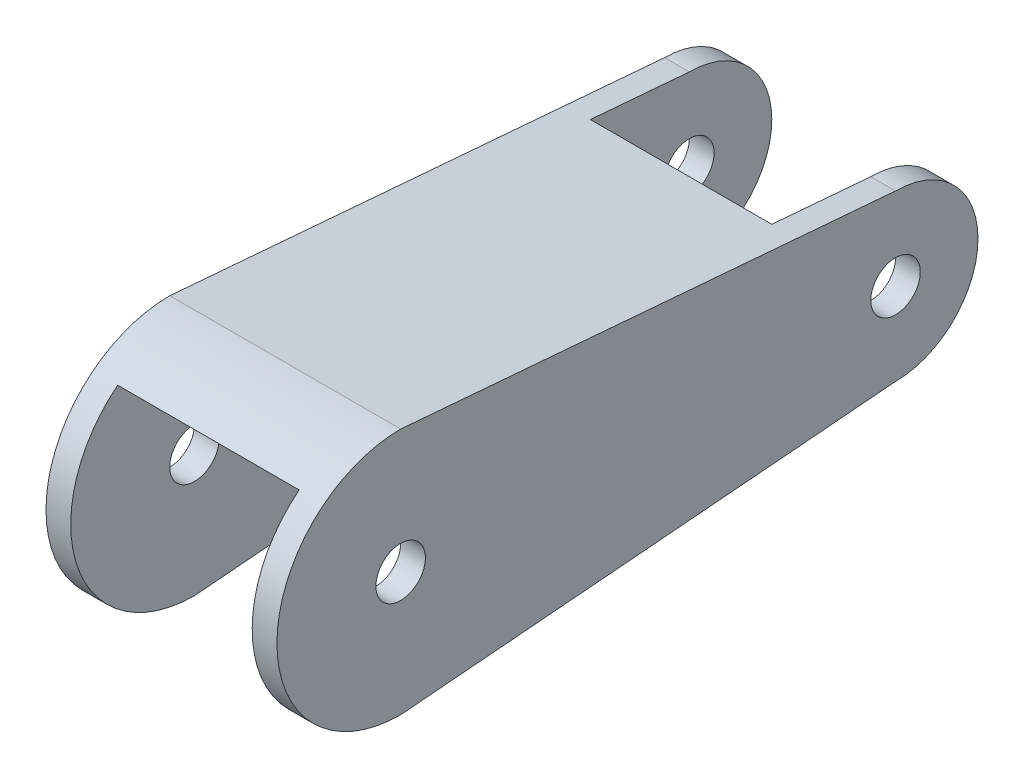
ISO-10303-21;
HEADER;
FILE_DESCRIPTION(('STEP AP214'),'2;1');
FILE_NAME('part.step','',(''),(''),'','','');
FILE_SCHEMA(('AUTOMOTIVE_DESIGN { 1 0 10303 214 1 1 1 1 }'));
ENDSEC;
DATA;
#1=APPLICATION_CONTEXT('core data for automotive mechanical design processes');
#2=APPLICATION_PROTOCOL_DEFINITION('international standard','automotive_design',2000,#1);
#3=PRODUCT_CONTEXT('',#1,'mechanical');
#4=PRODUCT('Part','Part','',(#3));
#5=PRODUCT_RELATED_PRODUCT_CATEGORY('part','',(#4));
#6=PRODUCT_DEFINITION_FORMATION('','',#4);
#7=PRODUCT_DEFINITION_CONTEXT('part definition',#1,'design');
#8=PRODUCT_DEFINITION('design','',#6,#7);
#9=PRODUCT_DEFINITION_SHAPE('','',#8);
#10=(LENGTH_UNIT() NAMED_UNIT(*) SI_UNIT(.MILLI.,.METRE.));
#11=(NAMED_UNIT(*) PLANE_ANGLE_UNIT() SI_UNIT($,.RADIAN.));
#12=(NAMED_UNIT(*) SI_UNIT($,.STERADIAN.) SOLID_ANGLE_UNIT());
#13=UNCERTAINTY_MEASURE_WITH_UNIT(LENGTH_MEASURE(1.E-05),#10,'distance_accuracy_value','');
#14=(GEOMETRIC_REPRESENTATION_CONTEXT(3) GLOBAL_UNCERTAINTY_ASSIGNED_CONTEXT((#13)) GLOBAL_UNIT_ASSIGNED_CONTEXT((#10,
#11,#12)) REPRESENTATION_CONTEXT('',''));
#15=CARTESIAN_POINT('',(0.,0.,0.));
#16=DIRECTION('',(0.,0.,1.));
#17=DIRECTION('',(1.,0.,0.));
#18=AXIS2_PLACEMENT_3D('',#15,#16,#17);
#19=CARTESIAN_POINT('',(70.,-37.5,0.));
#20=DIRECTION('',(0.,0.99654575824488,0.08304547985374));
#21=DIRECTION('',(0.,-0.08304547985374,0.99654575824488));
#22=AXIS2_PLACEMENT_3D('',#19,#20,#21);
#23=PLANE('',#22);
#24=DIRECTION('',(-1.,0.,0.));
#25=VECTOR('',#24,1.);
#26=CARTESIAN_POINT('',(70.,-37.5,0.));
#27=LINE('',#26,#25);
#28=CARTESIAN_POINT('',(70.,-37.5,0.));
#29=VERTEX_POINT('',#28);
#30=CARTESIAN_POINT('',(62.5,-37.5,0.));
#31=VERTEX_POINT('',#30);
#32=EDGE_CURVE('E182',#29,#31,#27,.T.);
#33=ORIENTED_EDGE('',*,*,#32,.T.);
#34=DIRECTION('',(0.,-0.08304547985374,0.99654575824488));
#35=VECTOR('',#34,1.);
#36=CARTESIAN_POINT('',(62.5,-37.5,0.));
#37=LINE('',#36,#35);
#38=CARTESIAN_POINT('',(62.5,-25.,-150.));
#39=VERTEX_POINT('',#38);
#40=EDGE_CURVE('E120',#39,#31,#37,.T.);
#41=ORIENTED_EDGE('',*,*,#40,.F.);
#42=DIRECTION('',(-1.,0.,0.));
#43=VECTOR('',#42,1.);
#44=CARTESIAN_POINT('',(70.,-25.,-150.));
#45=LINE('',#44,#43);
#46=CARTESIAN_POINT('',(70.,-25.,-150.));
#47=VERTEX_POINT('',#46);
#48=EDGE_CURVE('E178',#47,#39,#45,.T.);
#49=ORIENTED_EDGE('',*,*,#48,.F.);
#50=DIRECTION('',(0.,0.0830454798537399,-0.99654575824488));
#51=VECTOR('',#50,1.);
#52=CARTESIAN_POINT('',(70.,-37.5,0.));
#53=LINE('',#52,#51);
#54=EDGE_CURVE('E154',#29,#47,#53,.T.);
#55=ORIENTED_EDGE('',*,*,#54,.F.);
#56=EDGE_LOOP('',(#33,#41,#49,#55));
#57=FACE_BOUND('',#56,.T.);
#58=ADVANCED_FACE('F36',(#57),#23,.F.);
#59=CARTESIAN_POINT('',(7.49999999999999,37.5,-120.));
#60=DIRECTION('',(0.,0.,-1.));
#61=DIRECTION('',(-1.,0.,0.));
#62=AXIS2_PLACEMENT_3D('',#59,#60,#61);
#63=PLANE('',#62);
#64=DIRECTION('',(0.,-1.,0.));
#65=VECTOR('',#64,1.);
#66=CARTESIAN_POINT('',(62.5,37.5,-120.));
#67=LINE('',#66,#65);
#68=CARTESIAN_POINT('',(62.5,27.5,-120.));
#69=VERTEX_POINT('',#68);
#70=CARTESIAN_POINT('',(62.5,17.4653378510064,-120.));
#71=VERTEX_POINT('',#70);
#72=EDGE_CURVE('E61',#69,#71,#67,.T.);
#73=ORIENTED_EDGE('',*,*,#72,.T.);
#74=DIRECTION('',(-1.,0.,0.));
#75=VECTOR('',#74,1.);
#76=CARTESIAN_POINT('',(7.49999999999999,17.4653378510064,-120.));
#77=LINE('',#76,#75);
#78=CARTESIAN_POINT('',(7.49999999999999,17.4653378510064,-120.));
#79=VERTEX_POINT('',#78);
#80=EDGE_CURVE('E129',#71,#79,#77,.T.);
#81=ORIENTED_EDGE('',*,*,#80,.T.);
#82=DIRECTION('',(0.,-1.,0.));
#83=VECTOR('',#82,1.);
#84=CARTESIAN_POINT('',(7.49999999999999,37.5,-120.));
#85=LINE('',#84,#83);
#86=CARTESIAN_POINT('',(7.49999999999999,27.5,-120.));
#87=VERTEX_POINT('',#86);
#88=EDGE_CURVE('E140',#87,#79,#85,.T.);
#89=ORIENTED_EDGE('',*,*,#88,.F.);
#90=DIRECTION('',(1.,0.,0.));
#91=VECTOR('',#90,1.);
#92=CARTESIAN_POINT('',(70.,27.5,-120.));
#93=LINE('',#92,#91);
#94=EDGE_CURVE('E45',#87,#69,#93,.T.);
#95=ORIENTED_EDGE('',*,*,#94,.T.);
#96=EDGE_LOOP('',(#73,#81,#89,#95));
#97=FACE_BOUND('',#96,.T.);
#98=ADVANCED_FACE('F209',(#97),#63,.T.);
#99=DIRECTION('',(0.,0.08304547985374,-0.99654575824488));
#100=VECTOR('',#99,1.);
#101=CARTESIAN_POINT('',(7.49999999999999,-37.5,0.));
#102=LINE('',#101,#100);
#103=CARTESIAN_POINT('',(7.50000000000001,-37.5,0.));
#104=VERTEX_POINT('',#103);
#105=CARTESIAN_POINT('',(7.49999999999998,-25.,-150.));
#106=VERTEX_POINT('',#105);
#107=EDGE_CURVE('E148',#104,#106,#102,.T.);
#108=ORIENTED_EDGE('',*,*,#107,.F.);
#109=CARTESIAN_POINT('',(0.,-37.5,0.));
#110=VERTEX_POINT('',#109);
#111=EDGE_CURVE('E181',#104,#110,#27,.T.);
#112=ORIENTED_EDGE('',*,*,#111,.T.);
#113=DIRECTION('',(0.,0.0830454798537399,-0.99654575824488));
#114=VECTOR('',#113,1.);
#115=CARTESIAN_POINT('',(0.,-37.5,0.));
#116=LINE('',#115,#114);
#117=CARTESIAN_POINT('',(0.,-25.,-150.));
#118=VERTEX_POINT('',#117);
#119=EDGE_CURVE('E164',#110,#118,#116,.T.);
#120=ORIENTED_EDGE('',*,*,#119,.T.);
#121=EDGE_CURVE('E177',#106,#118,#45,.T.);
#122=ORIENTED_EDGE('',*,*,#121,.F.);
#123=EDGE_LOOP('',(#108,#112,#120,#122));
#124=FACE_BOUND('',#123,.T.);
#125=ADVANCED_FACE('F233',(#124),#23,.F.);
#126=CARTESIAN_POINT('',(70.,0.,-150.));
#127=DIRECTION('',(-1.,0.,0.));
#128=DIRECTION('',(0.,0.,1.));
#129=AXIS2_PLACEMENT_3D('',#126,#127,#128);
#130=CYLINDRICAL_SURFACE('',#129,25.);
#131=DIRECTION('',(-1.,0.,0.));
#132=VECTOR('',#131,1.);
#133=CARTESIAN_POINT('',(70.,25.,-150.));
#134=LINE('',#133,#132);
#135=CARTESIAN_POINT('',(7.49999999999998,25.,-150.));
#136=VERTEX_POINT('',#135);
#137=CARTESIAN_POINT('',(0.,25.,-150.));
#138=VERTEX_POINT('',#137);
#139=EDGE_CURVE('E173',#136,#138,#134,.T.);
#140=ORIENTED_EDGE('',*,*,#139,.F.);
#141=CARTESIAN_POINT('',(7.49999999999998,0.,-150.));
#142=DIRECTION('',(1.,0.,0.));
#143=DIRECTION('',(0.,0.,-1.));
#144=AXIS2_PLACEMENT_3D('',#141,#142,#143);
#145=CIRCLE('',#144,25.);
#146=EDGE_CURVE('E146',#106,#136,#145,.T.);
#147=ORIENTED_EDGE('',*,*,#146,.F.);
#148=ORIENTED_EDGE('',*,*,#121,.T.);
#149=CARTESIAN_POINT('',(0.,0.,-150.));
#150=DIRECTION('',(1.,0.,0.));
#151=DIRECTION('',(0.,0.,-1.));
#152=AXIS2_PLACEMENT_3D('',#149,#150,#151);
#153=CIRCLE('',#152,25.);
#154=EDGE_CURVE('E167',#118,#138,#153,.T.);
#155=ORIENTED_EDGE('',*,*,#154,.T.);
#156=EDGE_LOOP('',(#140,#147,#148,#155));
#157=FACE_BOUND('',#156,.T.);
#158=ADVANCED_FACE('F236',(#157),#130,.T.);
#159=CARTESIAN_POINT('',(62.5,0.,-150.));
#160=DIRECTION('',(-1.,0.,0.));
#161=DIRECTION('',(0.,0.,1.));
#162=AXIS2_PLACEMENT_3D('',#159,#160,#161);
#163=CIRCLE('',#162,25.);
#164=CARTESIAN_POINT('',(62.5,25.,-150.));
#165=VERTEX_POINT('',#164);
#166=EDGE_CURVE('E143',#165,#39,#163,.T.);
#167=ORIENTED_EDGE('',*,*,#166,.F.);
#168=CARTESIAN_POINT('',(70.,25.,-150.));
#169=VERTEX_POINT('',#168);
#170=EDGE_CURVE('E174',#169,#165,#134,.T.);
#171=ORIENTED_EDGE('',*,*,#170,.F.);
#172=CARTESIAN_POINT('',(70.,0.,-150.));
#173=DIRECTION('',(1.,0.,0.));
#174=DIRECTION('',(0.,0.,-1.));
#175=AXIS2_PLACEMENT_3D('',#172,#173,#174);
#176=CIRCLE('',#175,25.);
#177=EDGE_CURVE('E157',#47,#169,#176,.T.);
#178=ORIENTED_EDGE('',*,*,#177,.F.);
#179=ORIENTED_EDGE('',*,*,#48,.T.);
#180=EDGE_LOOP('',(#167,#171,#178,#179));
#181=FACE_BOUND('',#180,.T.);
#182=ADVANCED_FACE('F220',(#181),#130,.T.);
#183=CARTESIAN_POINT('',(70.,37.5,0.));
#184=DIRECTION('',(0.,-0.99654575824488,0.08304547985374));
#185=DIRECTION('',(0.,-0.08304547985374,-0.99654575824488));
#186=AXIS2_PLACEMENT_3D('',#183,#184,#185);
#187=PLANE('',#186);
#188=DIRECTION('',(0.,0.08304547985374,0.99654575824488));
#189=VECTOR('',#188,1.);
#190=CARTESIAN_POINT('',(7.49999999999999,37.5,0.));
#191=LINE('',#190,#189);
#192=EDGE_CURVE('E11',#136,#87,#191,.T.);
#193=ORIENTED_EDGE('',*,*,#192,.F.);
#194=ORIENTED_EDGE('',*,*,#139,.T.);
#195=DIRECTION('',(0.,0.08304547985374,0.99654575824488));
#196=VECTOR('',#195,1.);
#197=CARTESIAN_POINT('',(0.,37.5,0.));
#198=LINE('',#197,#196);
#199=CARTESIAN_POINT('',(0.,37.5,0.));
#200=VERTEX_POINT('',#199);
#201=EDGE_CURVE('E155',#138,#200,#198,.T.);
#202=ORIENTED_EDGE('',*,*,#201,.T.);
#203=DIRECTION('',(-1.,0.,0.));
#204=VECTOR('',#203,1.);
#205=CARTESIAN_POINT('',(70.,37.5,0.));
#206=LINE('',#205,#204);
#207=CARTESIAN_POINT('',(70.,37.5,0.));
#208=VERTEX_POINT('',#207);
#209=EDGE_CURVE('E161',#208,#200,#206,.T.);
#210=ORIENTED_EDGE('',*,*,#209,.F.);
#211=DIRECTION('',(0.,0.08304547985374,0.99654575824488));
#212=VECTOR('',#211,1.);
#213=CARTESIAN_POINT('',(70.,37.5,0.));
#214=LINE('',#213,#212);
#215=EDGE_CURVE('E159',#169,#208,#214,.T.);
#216=ORIENTED_EDGE('',*,*,#215,.F.);
#217=ORIENTED_EDGE('',*,*,#170,.T.);
#218=DIRECTION('',(0.,-0.08304547985374,-0.99654575824488));
#219=VECTOR('',#218,1.);
#220=CARTESIAN_POINT('',(62.5,37.5,0.));
#221=LINE('',#220,#219);
#222=EDGE_CURVE('E184',#69,#165,#221,.T.);
#223=ORIENTED_EDGE('',*,*,#222,.F.);
#224=ORIENTED_EDGE('',*,*,#94,.F.);
#225=EDGE_LOOP('',(#193,#194,#202,#210,#216,#217,#223,#224));
#226=FACE_BOUND('',#225,.T.);
#227=ADVANCED_FACE('F212',(#226),#187,.F.);
#228=CARTESIAN_POINT('',(70.,0.,0.));
#229=DIRECTION('',(-1.,0.,0.));
#230=DIRECTION('',(0.,0.,1.));
#231=AXIS2_PLACEMENT_3D('',#228,#229,#230);
#232=CYLINDRICAL_SURFACE('',#231,37.5);
#233=ORIENTED_EDGE('',*,*,#111,.F.);
#234=CARTESIAN_POINT('',(7.49999999999999,0.,0.));
#235=DIRECTION('',(-1.,0.,0.));
#236=DIRECTION('',(0.,0.,1.));
#237=AXIS2_PLACEMENT_3D('',#234,#235,#236);
#238=CIRCLE('',#237,37.5);
#239=CARTESIAN_POINT('',(7.50000000000001,29.4047186919366,23.2725700911625));
#240=VERTEX_POINT('',#239);
#241=EDGE_CURVE('E125',#104,#240,#238,.T.);
#242=ORIENTED_EDGE('',*,*,#241,.T.);
#243=DIRECTION('',(-1.,0.,0.));
#244=VECTOR('',#243,1.);
#245=CARTESIAN_POINT('',(70.,29.4047186919367,23.2725700911625));
#246=LINE('',#245,#244);
#247=CARTESIAN_POINT('',(62.5,29.4047186919366,23.2725700911625));
#248=VERTEX_POINT('',#247);
#249=EDGE_CURVE('E128',#248,#240,#246,.T.);
#250=ORIENTED_EDGE('',*,*,#249,.F.);
#251=CARTESIAN_POINT('',(62.5,0.,0.));
#252=DIRECTION('',(1.,0.,0.));
#253=DIRECTION('',(0.,0.,-1.));
#254=AXIS2_PLACEMENT_3D('',#251,#252,#253);
#255=CIRCLE('',#254,37.5);
#256=EDGE_CURVE('E115',#248,#31,#255,.T.);
#257=ORIENTED_EDGE('',*,*,#256,.T.);
#258=ORIENTED_EDGE('',*,*,#32,.F.);
#259=CARTESIAN_POINT('',(70.,0.,0.));
#260=DIRECTION('',(1.,0.,0.));
#261=DIRECTION('',(0.,0.,-1.));
#262=AXIS2_PLACEMENT_3D('',#259,#260,#261);
#263=CIRCLE('',#262,37.5);
#264=EDGE_CURVE('E151',#208,#29,#263,.T.);
#265=ORIENTED_EDGE('',*,*,#264,.F.);
#266=ORIENTED_EDGE('',*,*,#209,.T.);
#267=CARTESIAN_POINT('',(0.,0.,0.));
#268=DIRECTION('',(1.,0.,0.));
#269=DIRECTION('',(0.,0.,-1.));
#270=AXIS2_PLACEMENT_3D('',#267,#268,#269);
#271=CIRCLE('',#270,37.5);
#272=EDGE_CURVE('E150',#200,#110,#271,.T.);
#273=ORIENTED_EDGE('',*,*,#272,.T.);
#274=EDGE_LOOP('',(#233,#242,#250,#257,#258,#265,#266,#273));
#275=FACE_BOUND('',#274,.T.);
#276=ADVANCED_FACE('F38',(#275),#232,.T.);
#277=CARTESIAN_POINT('',(70.,0.,0.));
#278=DIRECTION('',(1.,0.,0.));
#279=DIRECTION('',(0.,0.,-1.));
#280=AXIS2_PLACEMENT_3D('',#277,#278,#279);
#281=PLANE('',#280);
#282=CARTESIAN_POINT('',(70.,0.,-150.));
#283=DIRECTION('',(1.,0.,0.));
#284=DIRECTION('',(0.,0.,-1.));
#285=AXIS2_PLACEMENT_3D('',#282,#283,#284);
#286=CIRCLE('',#285,7.50000000000001);
#287=CARTESIAN_POINT('',(70.,0.,-157.5));
#288=VERTEX_POINT('',#287);
#289=EDGE_CURVE('E382',#288,#288,#286,.T.);
#290=ORIENTED_EDGE('',*,*,#289,.F.);
#291=EDGE_LOOP('',(#290));
#292=FACE_BOUND('',#291,.T.);
#293=CARTESIAN_POINT('',(70.,0.,0.));
#294=DIRECTION('',(1.,0.,0.));
#295=DIRECTION('',(0.,0.,-1.));
#296=AXIS2_PLACEMENT_3D('',#293,#294,#295);
#297=CIRCLE('',#296,7.5);
#298=CARTESIAN_POINT('',(70.,0.,-7.5));
#299=VERTEX_POINT('',#298);
#300=EDGE_CURVE('E194',#299,#299,#297,.T.);
#301=ORIENTED_EDGE('',*,*,#300,.F.);
#302=EDGE_LOOP('',(#301));
#303=FACE_BOUND('',#302,.T.);
#304=ORIENTED_EDGE('',*,*,#264,.T.);
#305=ORIENTED_EDGE('',*,*,#54,.T.);
#306=ORIENTED_EDGE('',*,*,#177,.T.);
#307=ORIENTED_EDGE('',*,*,#215,.T.);
#308=EDGE_LOOP('',(#304,#305,#306,#307));
#309=FACE_BOUND('',#308,.T.);
#310=ADVANCED_FACE('F222',(#292,#303,#309),#281,.T.);
#311=CARTESIAN_POINT('',(0.,0.,0.));
#312=DIRECTION('',(1.,0.,0.));
#313=DIRECTION('',(0.,0.,-1.));
#314=AXIS2_PLACEMENT_3D('',#311,#312,#313);
#315=PLANE('',#314);
#316=CARTESIAN_POINT('',(0.,0.,-150.));
#317=DIRECTION('',(1.,0.,0.));
#318=DIRECTION('',(0.,0.,-1.));
#319=AXIS2_PLACEMENT_3D('',#316,#317,#318);
#320=CIRCLE('',#319,7.50000000000001);
#321=CARTESIAN_POINT('',(0.,0.,-157.5));
#322=VERTEX_POINT('',#321);
#323=EDGE_CURVE('E381',#322,#322,#320,.T.);
#324=ORIENTED_EDGE('',*,*,#323,.T.);
#325=EDGE_LOOP('',(#324));
#326=FACE_BOUND('',#325,.T.);
#327=CARTESIAN_POINT('',(0.,0.,0.));
#328=DIRECTION('',(1.,0.,0.));
#329=DIRECTION('',(0.,0.,-1.));
#330=AXIS2_PLACEMENT_3D('',#327,#328,#329);
#331=CIRCLE('',#330,7.5);
#332=CARTESIAN_POINT('',(0.,0.,-7.5));
#333=VERTEX_POINT('',#332);
#334=EDGE_CURVE('E188',#333,#333,#331,.T.);
#335=ORIENTED_EDGE('',*,*,#334,.T.);
#336=EDGE_LOOP('',(#335));
#337=FACE_BOUND('',#336,.T.);
#338=ORIENTED_EDGE('',*,*,#272,.F.);
#339=ORIENTED_EDGE('',*,*,#201,.F.);
#340=ORIENTED_EDGE('',*,*,#154,.F.);
#341=ORIENTED_EDGE('',*,*,#119,.F.);
#342=EDGE_LOOP('',(#338,#339,#340,#341));
#343=FACE_BOUND('',#342,.T.);
#344=ADVANCED_FACE('F229',(#326,#337,#343),#315,.F.);
#345=CARTESIAN_POINT('',(7.49999999999999,37.5,-175.));
#346=DIRECTION('',(1.,0.,0.));
#347=DIRECTION('',(0.,0.,-1.));
#348=AXIS2_PLACEMENT_3D('',#345,#346,#347);
#349=PLANE('',#348);
#350=CARTESIAN_POINT('',(7.49999999999999,0.,-150.));
#351=DIRECTION('',(1.,0.,0.));
#352=DIRECTION('',(0.,0.,-1.));
#353=AXIS2_PLACEMENT_3D('',#350,#351,#352);
#354=CIRCLE('',#353,7.50000000000001);
#355=CARTESIAN_POINT('',(7.49999999999999,0.,-157.5));
#356=VERTEX_POINT('',#355);
#357=EDGE_CURVE('E199',#356,#356,#354,.T.);
#358=ORIENTED_EDGE('',*,*,#357,.F.);
#359=EDGE_LOOP('',(#358));
#360=FACE_BOUND('',#359,.T.);
#361=CARTESIAN_POINT('',(7.5,0.,0.));
#362=DIRECTION('',(1.,0.,0.));
#363=DIRECTION('',(0.,0.,-1.));
#364=AXIS2_PLACEMENT_3D('',#361,#362,#363);
#365=CIRCLE('',#364,7.5);
#366=CARTESIAN_POINT('',(7.5,0.,-7.5));
#367=VERTEX_POINT('',#366);
#368=EDGE_CURVE('E130',#367,#367,#365,.T.);
#369=ORIENTED_EDGE('',*,*,#368,.F.);
#370=EDGE_LOOP('',(#369));
#371=FACE_BOUND('',#370,.T.);
#372=ORIENTED_EDGE('',*,*,#241,.F.);
#373=ORIENTED_EDGE('',*,*,#107,.T.);
#374=ORIENTED_EDGE('',*,*,#146,.T.);
#375=ORIENTED_EDGE('',*,*,#192,.T.);
#376=ORIENTED_EDGE('',*,*,#88,.T.);
#377=DIRECTION('',(0.,0.08304547985374,0.99654575824488));
#378=VECTOR('',#377,1.);
#379=CARTESIAN_POINT('',(7.49999999999999,17.1552320727236,-123.721269339394));
#380=LINE('',#379,#378);
#381=EDGE_CURVE('E53',#79,#240,#380,.T.);
#382=ORIENTED_EDGE('',*,*,#381,.T.);
#383=EDGE_LOOP('',(#372,#373,#374,#375,#376,#382));
#384=FACE_BOUND('',#383,.T.);
#385=ADVANCED_FACE('F204',(#360,#371,#384),#349,.T.);
#386=CARTESIAN_POINT('',(62.5,37.5,-175.));
#387=DIRECTION('',(-1.,0.,0.));
#388=DIRECTION('',(0.,0.,1.));
#389=AXIS2_PLACEMENT_3D('',#386,#387,#388);
#390=PLANE('',#389);
#391=CARTESIAN_POINT('',(62.5,0.,-150.));
#392=DIRECTION('',(-1.,0.,0.));
#393=DIRECTION('',(0.,0.,1.));
#394=AXIS2_PLACEMENT_3D('',#391,#392,#393);
#395=CIRCLE('',#394,7.50000000000001);
#396=CARTESIAN_POINT('',(62.5,0.,-142.5));
#397=VERTEX_POINT('',#396);
#398=EDGE_CURVE('E40',#397,#397,#395,.T.);
#399=ORIENTED_EDGE('',*,*,#398,.F.);
#400=EDGE_LOOP('',(#399));
#401=FACE_BOUND('',#400,.T.);
#402=CARTESIAN_POINT('',(62.5,0.,0.));
#403=DIRECTION('',(-1.,0.,0.));
#404=DIRECTION('',(0.,0.,1.));
#405=AXIS2_PLACEMENT_3D('',#402,#403,#404);
#406=CIRCLE('',#405,7.5);
#407=CARTESIAN_POINT('',(62.5,0.,7.5));
#408=VERTEX_POINT('',#407);
#409=EDGE_CURVE('E186',#408,#408,#406,.T.);
#410=ORIENTED_EDGE('',*,*,#409,.F.);
#411=EDGE_LOOP('',(#410));
#412=FACE_BOUND('',#411,.T.);
#413=ORIENTED_EDGE('',*,*,#40,.T.);
#414=ORIENTED_EDGE('',*,*,#256,.F.);
#415=DIRECTION('',(0.,-0.08304547985374,-0.99654575824488));
#416=VECTOR('',#415,1.);
#417=CARTESIAN_POINT('',(62.5,17.1552320727236,-123.721269339394));
#418=LINE('',#417,#416);
#419=EDGE_CURVE('E118',#248,#71,#418,.T.);
#420=ORIENTED_EDGE('',*,*,#419,.T.);
#421=ORIENTED_EDGE('',*,*,#72,.F.);
#422=ORIENTED_EDGE('',*,*,#222,.T.);
#423=ORIENTED_EDGE('',*,*,#166,.T.);
#424=EDGE_LOOP('',(#413,#414,#420,#421,#422,#423));
#425=FACE_BOUND('',#424,.T.);
#426=ADVANCED_FACE('F117',(#401,#412,#425),#390,.T.);
#427=CARTESIAN_POINT('',(0.,27.2759217278961,-2.27299347732467));
#428=DIRECTION('',(0.,-0.99654575824488,0.08304547985374));
#429=DIRECTION('',(0.,-0.08304547985374,-0.99654575824488));
#430=AXIS2_PLACEMENT_3D('',#427,#428,#429);
#431=PLANE('',#430);
#432=ORIENTED_EDGE('',*,*,#249,.T.);
#433=ORIENTED_EDGE('',*,*,#381,.F.);
#434=ORIENTED_EDGE('',*,*,#80,.F.);
#435=ORIENTED_EDGE('',*,*,#419,.F.);
#436=EDGE_LOOP('',(#432,#433,#434,#435));
#437=FACE_BOUND('',#436,.T.);
#438=ADVANCED_FACE('F127',(#437),#431,.T.);
#439=CARTESIAN_POINT('',(0.,0.,0.));
#440=DIRECTION('',(1.,0.,0.));
#441=DIRECTION('',(0.,0.,-1.));
#442=AXIS2_PLACEMENT_3D('',#439,#440,#441);
#443=CYLINDRICAL_SURFACE('',#442,7.5);
#444=ORIENTED_EDGE('',*,*,#409,.T.);
#445=EDGE_LOOP('',(#444));
#446=FACE_BOUND('',#445,.T.);
#447=ORIENTED_EDGE('',*,*,#300,.T.);
#448=EDGE_LOOP('',(#447));
#449=FACE_BOUND('',#448,.T.);
#450=ADVANCED_FACE('F295',(#446,#449),#443,.F.);
#451=ORIENTED_EDGE('',*,*,#368,.T.);
#452=EDGE_LOOP('',(#451));
#453=FACE_BOUND('',#452,.T.);
#454=ORIENTED_EDGE('',*,*,#334,.F.);
#455=EDGE_LOOP('',(#454));
#456=FACE_BOUND('',#455,.T.);
#457=ADVANCED_FACE('F301',(#453,#456),#443,.F.);
#458=CARTESIAN_POINT('',(0.,0.,-150.));
#459=DIRECTION('',(1.,0.,0.));
#460=DIRECTION('',(0.,0.,-1.));
#461=AXIS2_PLACEMENT_3D('',#458,#459,#460);
#462=CYLINDRICAL_SURFACE('',#461,7.50000000000001);
#463=ORIENTED_EDGE('',*,*,#398,.T.);
#464=EDGE_LOOP('',(#463));
#465=FACE_BOUND('',#464,.T.);
#466=ORIENTED_EDGE('',*,*,#289,.T.);
#467=EDGE_LOOP('',(#466));
#468=FACE_BOUND('',#467,.T.);
#469=ADVANCED_FACE('F307',(#465,#468),#462,.F.);
#470=ORIENTED_EDGE('',*,*,#357,.T.);
#471=EDGE_LOOP('',(#470));
#472=FACE_BOUND('',#471,.T.);
#473=ORIENTED_EDGE('',*,*,#323,.F.);
#474=EDGE_LOOP('',(#473));
#475=FACE_BOUND('',#474,.T.);
#476=ADVANCED_FACE('F313',(#472,#475),#462,.F.);
#477=CLOSED_SHELL('',(#58,#98,#125,#158,#182,#227,#276,#310,#344,#385,#426,#438,#450,#457,#469,#476));
#478=MANIFOLD_SOLID_BREP('B2',#477);
#479=ADVANCED_BREP_SHAPE_REPRESENTATION('',(#18,#478),#14);
#480=SHAPE_DEFINITION_REPRESENTATION(#9,#479);
ENDSEC;
END-ISO-10303-21;
